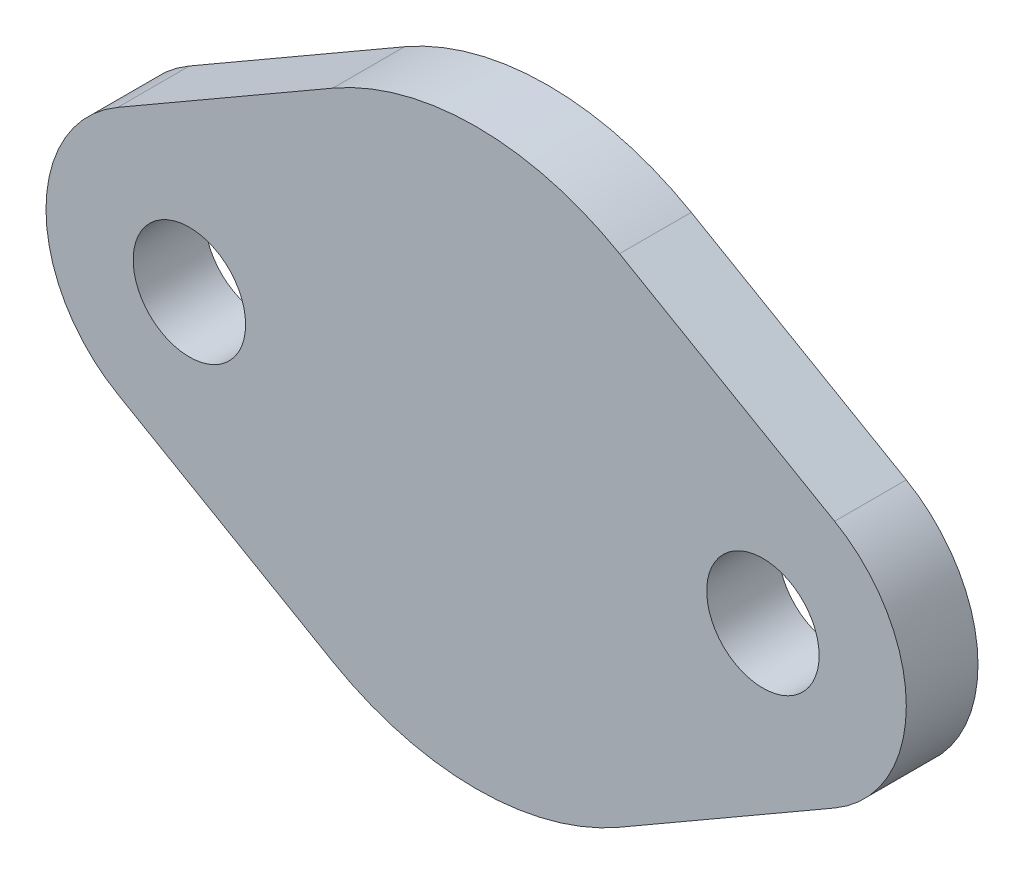
ISO-10303-21;
HEADER;
FILE_DESCRIPTION(('STEP AP214'),'2;1');
FILE_NAME('part.step','',(''),(''),'','','');
FILE_SCHEMA(('AUTOMOTIVE_DESIGN { 1 0 10303 214 1 1 1 1 }'));
ENDSEC;
DATA;
#1=APPLICATION_CONTEXT('core data for automotive mechanical design processes');
#2=APPLICATION_PROTOCOL_DEFINITION('international standard','automotive_design',2000,#1);
#3=PRODUCT_CONTEXT('',#1,'mechanical');
#4=PRODUCT('Part','Part','',(#3));
#5=PRODUCT_RELATED_PRODUCT_CATEGORY('part','',(#4));
#6=PRODUCT_DEFINITION_FORMATION('','',#4);
#7=PRODUCT_DEFINITION_CONTEXT('part definition',#1,'design');
#8=PRODUCT_DEFINITION('design','',#6,#7);
#9=PRODUCT_DEFINITION_SHAPE('','',#8);
#10=(LENGTH_UNIT() NAMED_UNIT(*) SI_UNIT(.MILLI.,.METRE.));
#11=(NAMED_UNIT(*) PLANE_ANGLE_UNIT() SI_UNIT($,.RADIAN.));
#12=(NAMED_UNIT(*) SI_UNIT($,.STERADIAN.) SOLID_ANGLE_UNIT());
#13=UNCERTAINTY_MEASURE_WITH_UNIT(LENGTH_MEASURE(1.E-05),#10,'distance_accuracy_value','');
#14=(GEOMETRIC_REPRESENTATION_CONTEXT(3) GLOBAL_UNCERTAINTY_ASSIGNED_CONTEXT((#13)) GLOBAL_UNIT_ASSIGNED_CONTEXT((#10,
#11,#12)) REPRESENTATION_CONTEXT('',''));
#15=CARTESIAN_POINT('',(0.,0.,0.));
#16=DIRECTION('',(0.,0.,1.));
#17=DIRECTION('',(1.,0.,0.));
#18=AXIS2_PLACEMENT_3D('',#15,#16,#17);
#19=CARTESIAN_POINT('',(-12.7,0.,1.5875));
#20=DIRECTION('',(0.,0.,1.));
#21=DIRECTION('',(1.,0.,0.));
#22=AXIS2_PLACEMENT_3D('',#19,#20,#21);
#23=PLANE('',#22);
#24=CARTESIAN_POINT('',(-12.7,0.,1.5875));
#25=DIRECTION('',(0.,0.,1.));
#26=DIRECTION('',(1.,0.,0.));
#27=AXIS2_PLACEMENT_3D('',#24,#25,#26);
#28=CIRCLE('',#27,2.4892);
#29=CARTESIAN_POINT('',(-10.2108,0.,1.5875));
#30=VERTEX_POINT('',#29);
#31=EDGE_CURVE('E152',#30,#30,#28,.T.);
#32=ORIENTED_EDGE('',*,*,#31,.F.);
#33=EDGE_LOOP('',(#32));
#34=FACE_BOUND('',#33,.T.);
#35=CARTESIAN_POINT('',(-12.7,0.,1.5875));
#36=DIRECTION('',(0.,0.,1.));
#37=DIRECTION('',(1.,0.,0.));
#38=AXIS2_PLACEMENT_3D('',#35,#36,#37);
#39=CIRCLE('',#38,6.35);
#40=CARTESIAN_POINT('',(-15.875,5.49926131403118,1.5875));
#41=VERTEX_POINT('',#40);
#42=CARTESIAN_POINT('',(-15.875,-5.49926131403118,1.5875));
#43=VERTEX_POINT('',#42);
#44=EDGE_CURVE('E170',#41,#43,#39,.T.);
#45=ORIENTED_EDGE('',*,*,#44,.T.);
#46=DIRECTION('',(0.866025403784439,-0.5,0.));
#47=VECTOR('',#46,1.);
#48=CARTESIAN_POINT('',(-15.875,-5.49926131403118,1.5875));
#49=LINE('',#48,#47);
#50=CARTESIAN_POINT('',(-6.34999999999999,-10.9985226280624,1.5875));
#51=VERTEX_POINT('',#50);
#52=EDGE_CURVE('E106',#43,#51,#49,.T.);
#53=ORIENTED_EDGE('',*,*,#52,.T.);
#54=CARTESIAN_POINT('',(0.,0.,1.5875));
#55=DIRECTION('',(0.,0.,1.));
#56=DIRECTION('',(1.,0.,0.));
#57=AXIS2_PLACEMENT_3D('',#54,#55,#56);
#58=CIRCLE('',#57,12.7);
#59=CARTESIAN_POINT('',(6.35,-10.9985226280624,1.5875));
#60=VERTEX_POINT('',#59);
#61=EDGE_CURVE('E191',#51,#60,#58,.T.);
#62=ORIENTED_EDGE('',*,*,#61,.T.);
#63=DIRECTION('',(0.866025403784438,0.5,0.));
#64=VECTOR('',#63,1.);
#65=CARTESIAN_POINT('',(15.875,-5.49926131403118,1.5875));
#66=LINE('',#65,#64);
#67=CARTESIAN_POINT('',(15.875,-5.49926131403118,1.5875));
#68=VERTEX_POINT('',#67);
#69=EDGE_CURVE('E205',#60,#68,#66,.T.);
#70=ORIENTED_EDGE('',*,*,#69,.T.);
#71=CARTESIAN_POINT('',(12.7,0.,1.5875));
#72=DIRECTION('',(0.,0.,1.));
#73=DIRECTION('',(1.,0.,0.));
#74=AXIS2_PLACEMENT_3D('',#71,#72,#73);
#75=CIRCLE('',#74,6.35);
#76=CARTESIAN_POINT('',(15.875,5.49926131403119,1.5875));
#77=VERTEX_POINT('',#76);
#78=EDGE_CURVE('E125',#68,#77,#75,.T.);
#79=ORIENTED_EDGE('',*,*,#78,.T.);
#80=DIRECTION('',(-0.866025403784439,0.5,0.));
#81=VECTOR('',#80,1.);
#82=CARTESIAN_POINT('',(6.34999999999999,10.9985226280624,1.5875));
#83=LINE('',#82,#81);
#84=CARTESIAN_POINT('',(6.34999999999999,10.9985226280624,1.5875));
#85=VERTEX_POINT('',#84);
#86=EDGE_CURVE('E119',#77,#85,#83,.T.);
#87=ORIENTED_EDGE('',*,*,#86,.T.);
#88=CARTESIAN_POINT('',(0.,0.,1.5875));
#89=DIRECTION('',(0.,0.,1.));
#90=DIRECTION('',(1.,0.,0.));
#91=AXIS2_PLACEMENT_3D('',#88,#89,#90);
#92=CIRCLE('',#91,12.7);
#93=CARTESIAN_POINT('',(-6.35,10.9985226280624,1.5875));
#94=VERTEX_POINT('',#93);
#95=EDGE_CURVE('E123',#85,#94,#92,.T.);
#96=ORIENTED_EDGE('',*,*,#95,.T.);
#97=DIRECTION('',(-0.866025403784439,-0.5,0.));
#98=VECTOR('',#97,1.);
#99=CARTESIAN_POINT('',(-15.875,5.49926131403118,1.5875));
#100=LINE('',#99,#98);
#101=EDGE_CURVE('E63',#94,#41,#100,.T.);
#102=ORIENTED_EDGE('',*,*,#101,.T.);
#103=EDGE_LOOP('',(#45,#53,#62,#70,#79,#87,#96,#102));
#104=FACE_BOUND('',#103,.T.);
#105=CARTESIAN_POINT('',(12.7,0.,1.5875));
#106=DIRECTION('',(0.,0.,1.));
#107=DIRECTION('',(1.,0.,0.));
#108=AXIS2_PLACEMENT_3D('',#105,#106,#107);
#109=CIRCLE('',#108,2.4892);
#110=CARTESIAN_POINT('',(15.1892,0.,1.5875));
#111=VERTEX_POINT('',#110);
#112=EDGE_CURVE('E219',#111,#111,#109,.T.);
#113=ORIENTED_EDGE('',*,*,#112,.F.);
#114=EDGE_LOOP('',(#113));
#115=FACE_BOUND('',#114,.T.);
#116=ADVANCED_FACE('F45',(#34,#104,#115),#23,.T.);
#117=CARTESIAN_POINT('',(-12.7,0.,-1.5875));
#118=DIRECTION('',(0.,0.,1.));
#119=DIRECTION('',(1.,0.,0.));
#120=AXIS2_PLACEMENT_3D('',#117,#118,#119);
#121=PLANE('',#120);
#122=CARTESIAN_POINT('',(-12.7,0.,-1.5875));
#123=DIRECTION('',(0.,0.,1.));
#124=DIRECTION('',(1.,0.,0.));
#125=AXIS2_PLACEMENT_3D('',#122,#123,#124);
#126=CIRCLE('',#125,6.35);
#127=CARTESIAN_POINT('',(-15.875,5.49926131403118,-1.5875));
#128=VERTEX_POINT('',#127);
#129=CARTESIAN_POINT('',(-15.875,-5.49926131403118,-1.5875));
#130=VERTEX_POINT('',#129);
#131=EDGE_CURVE('E147',#128,#130,#126,.T.);
#132=ORIENTED_EDGE('',*,*,#131,.F.);
#133=DIRECTION('',(-0.866025403784439,-0.5,0.));
#134=VECTOR('',#133,1.);
#135=CARTESIAN_POINT('',(-15.875,5.49926131403118,-1.5875));
#136=LINE('',#135,#134);
#137=CARTESIAN_POINT('',(-6.35,10.9985226280624,-1.5875));
#138=VERTEX_POINT('',#137);
#139=EDGE_CURVE('E98',#138,#128,#136,.T.);
#140=ORIENTED_EDGE('',*,*,#139,.F.);
#141=CARTESIAN_POINT('',(0.,0.,-1.5875));
#142=DIRECTION('',(0.,0.,1.));
#143=DIRECTION('',(1.,0.,0.));
#144=AXIS2_PLACEMENT_3D('',#141,#142,#143);
#145=CIRCLE('',#144,12.7);
#146=CARTESIAN_POINT('',(6.34999999999999,10.9985226280624,-1.5875));
#147=VERTEX_POINT('',#146);
#148=EDGE_CURVE('E92',#147,#138,#145,.T.);
#149=ORIENTED_EDGE('',*,*,#148,.F.);
#150=DIRECTION('',(-0.866025403784439,0.5,0.));
#151=VECTOR('',#150,1.);
#152=CARTESIAN_POINT('',(6.34999999999999,10.9985226280624,-1.5875));
#153=LINE('',#152,#151);
#154=CARTESIAN_POINT('',(15.875,5.49926131403119,-1.5875));
#155=VERTEX_POINT('',#154);
#156=EDGE_CURVE('E134',#155,#147,#153,.T.);
#157=ORIENTED_EDGE('',*,*,#156,.F.);
#158=CARTESIAN_POINT('',(12.7,0.,-1.5875));
#159=DIRECTION('',(0.,0.,1.));
#160=DIRECTION('',(1.,0.,0.));
#161=AXIS2_PLACEMENT_3D('',#158,#159,#160);
#162=CIRCLE('',#161,6.35);
#163=CARTESIAN_POINT('',(15.875,-5.49926131403118,-1.5875));
#164=VERTEX_POINT('',#163);
#165=EDGE_CURVE('E161',#164,#155,#162,.T.);
#166=ORIENTED_EDGE('',*,*,#165,.F.);
#167=DIRECTION('',(0.866025403784438,0.5,0.));
#168=VECTOR('',#167,1.);
#169=CARTESIAN_POINT('',(15.875,-5.49926131403118,-1.5875));
#170=LINE('',#169,#168);
#171=CARTESIAN_POINT('',(6.35,-10.9985226280624,-1.5875));
#172=VERTEX_POINT('',#171);
#173=EDGE_CURVE('E158',#172,#164,#170,.T.);
#174=ORIENTED_EDGE('',*,*,#173,.F.);
#175=CARTESIAN_POINT('',(0.,0.,-1.5875));
#176=DIRECTION('',(0.,0.,1.));
#177=DIRECTION('',(1.,0.,0.));
#178=AXIS2_PLACEMENT_3D('',#175,#176,#177);
#179=CIRCLE('',#178,12.7);
#180=CARTESIAN_POINT('',(-6.34999999999999,-10.9985226280624,-1.5875));
#181=VERTEX_POINT('',#180);
#182=EDGE_CURVE('E155',#181,#172,#179,.T.);
#183=ORIENTED_EDGE('',*,*,#182,.F.);
#184=DIRECTION('',(0.866025403784439,-0.5,0.));
#185=VECTOR('',#184,1.);
#186=CARTESIAN_POINT('',(-15.875,-5.49926131403118,-1.5875));
#187=LINE('',#186,#185);
#188=EDGE_CURVE('E151',#130,#181,#187,.T.);
#189=ORIENTED_EDGE('',*,*,#188,.F.);
#190=EDGE_LOOP('',(#132,#140,#149,#157,#166,#174,#183,#189));
#191=FACE_BOUND('',#190,.T.);
#192=CARTESIAN_POINT('',(-12.7,0.,-1.5875));
#193=DIRECTION('',(0.,0.,1.));
#194=DIRECTION('',(1.,0.,0.));
#195=AXIS2_PLACEMENT_3D('',#192,#193,#194);
#196=CIRCLE('',#195,2.4892);
#197=CARTESIAN_POINT('',(-10.2108,0.,-1.5875));
#198=VERTEX_POINT('',#197);
#199=EDGE_CURVE('E215',#198,#198,#196,.T.);
#200=ORIENTED_EDGE('',*,*,#199,.T.);
#201=EDGE_LOOP('',(#200));
#202=FACE_BOUND('',#201,.T.);
#203=CARTESIAN_POINT('',(12.7,0.,-1.5875));
#204=DIRECTION('',(0.,0.,1.));
#205=DIRECTION('',(1.,0.,0.));
#206=AXIS2_PLACEMENT_3D('',#203,#204,#205);
#207=CIRCLE('',#206,2.4892);
#208=CARTESIAN_POINT('',(15.1892,0.,-1.5875));
#209=VERTEX_POINT('',#208);
#210=EDGE_CURVE('E223',#209,#209,#207,.T.);
#211=ORIENTED_EDGE('',*,*,#210,.T.);
#212=EDGE_LOOP('',(#211));
#213=FACE_BOUND('',#212,.T.);
#214=ADVANCED_FACE('F195',(#191,#202,#213),#121,.F.);
#215=CARTESIAN_POINT('',(-12.7,0.,1.5875));
#216=DIRECTION('',(0.,0.,-1.));
#217=DIRECTION('',(-1.,0.,0.));
#218=AXIS2_PLACEMENT_3D('',#215,#216,#217);
#219=CYLINDRICAL_SURFACE('',#218,6.35);
#220=ORIENTED_EDGE('',*,*,#131,.T.);
#221=DIRECTION('',(0.,0.,-1.));
#222=VECTOR('',#221,1.);
#223=CARTESIAN_POINT('',(-15.875,-5.49926131403118,1.5875));
#224=LINE('',#223,#222);
#225=EDGE_CURVE('E11',#43,#130,#224,.T.);
#226=ORIENTED_EDGE('',*,*,#225,.F.);
#227=ORIENTED_EDGE('',*,*,#44,.F.);
#228=DIRECTION('',(0.,0.,-1.));
#229=VECTOR('',#228,1.);
#230=CARTESIAN_POINT('',(-15.875,5.49926131403118,1.5875));
#231=LINE('',#230,#229);
#232=EDGE_CURVE('E143',#41,#128,#231,.T.);
#233=ORIENTED_EDGE('',*,*,#232,.T.);
#234=EDGE_LOOP('',(#220,#226,#227,#233));
#235=FACE_BOUND('',#234,.T.);
#236=ADVANCED_FACE('F47',(#235),#219,.T.);
#237=CARTESIAN_POINT('',(-15.875,-5.49926131403118,1.5875));
#238=DIRECTION('',(0.5,0.866025403784439,0.));
#239=DIRECTION('',(-0.866025403784439,0.5,0.));
#240=AXIS2_PLACEMENT_3D('',#237,#238,#239);
#241=PLANE('',#240);
#242=ORIENTED_EDGE('',*,*,#188,.T.);
#243=DIRECTION('',(0.,0.,-1.));
#244=VECTOR('',#243,1.);
#245=CARTESIAN_POINT('',(-6.34999999999999,-10.9985226280624,1.5875));
#246=LINE('',#245,#244);
#247=EDGE_CURVE('E55',#51,#181,#246,.T.);
#248=ORIENTED_EDGE('',*,*,#247,.F.);
#249=ORIENTED_EDGE('',*,*,#52,.F.);
#250=ORIENTED_EDGE('',*,*,#225,.T.);
#251=EDGE_LOOP('',(#242,#248,#249,#250));
#252=FACE_BOUND('',#251,.T.);
#253=ADVANCED_FACE('F257',(#252),#241,.F.);
#254=CARTESIAN_POINT('',(0.,0.,1.5875));
#255=DIRECTION('',(0.,0.,-1.));
#256=DIRECTION('',(-1.,0.,0.));
#257=AXIS2_PLACEMENT_3D('',#254,#255,#256);
#258=CYLINDRICAL_SURFACE('',#257,12.7);
#259=ORIENTED_EDGE('',*,*,#182,.T.);
#260=DIRECTION('',(0.,0.,-1.));
#261=VECTOR('',#260,1.);
#262=CARTESIAN_POINT('',(6.35,-10.9985226280624,1.5875));
#263=LINE('',#262,#261);
#264=EDGE_CURVE('E181',#60,#172,#263,.T.);
#265=ORIENTED_EDGE('',*,*,#264,.F.);
#266=ORIENTED_EDGE('',*,*,#61,.F.);
#267=ORIENTED_EDGE('',*,*,#247,.T.);
#268=EDGE_LOOP('',(#259,#265,#266,#267));
#269=FACE_BOUND('',#268,.T.);
#270=ADVANCED_FACE('F189',(#269),#258,.T.);
#271=CARTESIAN_POINT('',(15.875,-5.49926131403118,1.5875));
#272=DIRECTION('',(-0.5,0.866025403784438,0.));
#273=DIRECTION('',(-0.866025403784438,-0.5,0.));
#274=AXIS2_PLACEMENT_3D('',#271,#272,#273);
#275=PLANE('',#274);
#276=ORIENTED_EDGE('',*,*,#173,.T.);
#277=DIRECTION('',(0.,0.,-1.));
#278=VECTOR('',#277,1.);
#279=CARTESIAN_POINT('',(15.875,-5.49926131403118,1.5875));
#280=LINE('',#279,#278);
#281=EDGE_CURVE('E177',#68,#164,#280,.T.);
#282=ORIENTED_EDGE('',*,*,#281,.F.);
#283=ORIENTED_EDGE('',*,*,#69,.F.);
#284=ORIENTED_EDGE('',*,*,#264,.T.);
#285=EDGE_LOOP('',(#276,#282,#283,#284));
#286=FACE_BOUND('',#285,.T.);
#287=ADVANCED_FACE('F200',(#286),#275,.F.);
#288=CARTESIAN_POINT('',(12.7,0.,1.5875));
#289=DIRECTION('',(0.,0.,-1.));
#290=DIRECTION('',(-1.,0.,0.));
#291=AXIS2_PLACEMENT_3D('',#288,#289,#290);
#292=CYLINDRICAL_SURFACE('',#291,6.35);
#293=ORIENTED_EDGE('',*,*,#165,.T.);
#294=DIRECTION('',(0.,0.,-1.));
#295=VECTOR('',#294,1.);
#296=CARTESIAN_POINT('',(15.875,5.49926131403119,1.5875));
#297=LINE('',#296,#295);
#298=EDGE_CURVE('E136',#77,#155,#297,.T.);
#299=ORIENTED_EDGE('',*,*,#298,.F.);
#300=ORIENTED_EDGE('',*,*,#78,.F.);
#301=ORIENTED_EDGE('',*,*,#281,.T.);
#302=EDGE_LOOP('',(#293,#299,#300,#301));
#303=FACE_BOUND('',#302,.T.);
#304=ADVANCED_FACE('F203',(#303),#292,.T.);
#305=CARTESIAN_POINT('',(6.34999999999999,10.9985226280624,1.5875));
#306=DIRECTION('',(-0.5,-0.866025403784439,0.));
#307=DIRECTION('',(0.866025403784439,-0.5,0.));
#308=AXIS2_PLACEMENT_3D('',#305,#306,#307);
#309=PLANE('',#308);
#310=ORIENTED_EDGE('',*,*,#156,.T.);
#311=DIRECTION('',(0.,0.,-1.));
#312=VECTOR('',#311,1.);
#313=CARTESIAN_POINT('',(6.34999999999999,10.9985226280624,1.5875));
#314=LINE('',#313,#312);
#315=EDGE_CURVE('E131',#85,#147,#314,.T.);
#316=ORIENTED_EDGE('',*,*,#315,.F.);
#317=ORIENTED_EDGE('',*,*,#86,.F.);
#318=ORIENTED_EDGE('',*,*,#298,.T.);
#319=EDGE_LOOP('',(#310,#316,#317,#318));
#320=FACE_BOUND('',#319,.T.);
#321=ADVANCED_FACE('F132',(#320),#309,.F.);
#322=CARTESIAN_POINT('',(0.,0.,1.5875));
#323=DIRECTION('',(0.,0.,-1.));
#324=DIRECTION('',(-1.,0.,0.));
#325=AXIS2_PLACEMENT_3D('',#322,#323,#324);
#326=CYLINDRICAL_SURFACE('',#325,12.7);
#327=ORIENTED_EDGE('',*,*,#148,.T.);
#328=DIRECTION('',(0.,0.,-1.));
#329=VECTOR('',#328,1.);
#330=CARTESIAN_POINT('',(-6.35,10.9985226280624,1.5875));
#331=LINE('',#330,#329);
#332=EDGE_CURVE('E137',#94,#138,#331,.T.);
#333=ORIENTED_EDGE('',*,*,#332,.F.);
#334=ORIENTED_EDGE('',*,*,#95,.F.);
#335=ORIENTED_EDGE('',*,*,#315,.T.);
#336=EDGE_LOOP('',(#327,#333,#334,#335));
#337=FACE_BOUND('',#336,.T.);
#338=ADVANCED_FACE('F139',(#337),#326,.T.);
#339=CARTESIAN_POINT('',(-15.875,5.49926131403118,1.5875));
#340=DIRECTION('',(0.5,-0.866025403784439,0.));
#341=DIRECTION('',(0.866025403784439,0.5,0.));
#342=AXIS2_PLACEMENT_3D('',#339,#340,#341);
#343=PLANE('',#342);
#344=ORIENTED_EDGE('',*,*,#139,.T.);
#345=ORIENTED_EDGE('',*,*,#232,.F.);
#346=ORIENTED_EDGE('',*,*,#101,.F.);
#347=ORIENTED_EDGE('',*,*,#332,.T.);
#348=EDGE_LOOP('',(#344,#345,#346,#347));
#349=FACE_BOUND('',#348,.T.);
#350=ADVANCED_FACE('F245',(#349),#343,.F.);
#351=CARTESIAN_POINT('',(-12.7,0.,1.5875));
#352=DIRECTION('',(0.,0.,-1.));
#353=DIRECTION('',(-1.,0.,0.));
#354=AXIS2_PLACEMENT_3D('',#351,#352,#353);
#355=CYLINDRICAL_SURFACE('',#354,2.4892);
#356=ORIENTED_EDGE('',*,*,#31,.T.);
#357=EDGE_LOOP('',(#356));
#358=FACE_BOUND('',#357,.T.);
#359=ORIENTED_EDGE('',*,*,#199,.F.);
#360=EDGE_LOOP('',(#359));
#361=FACE_BOUND('',#360,.T.);
#362=ADVANCED_FACE('F242',(#358,#361),#355,.F.);
#363=CARTESIAN_POINT('',(12.7,0.,1.5875));
#364=DIRECTION('',(0.,0.,-1.));
#365=DIRECTION('',(-1.,0.,0.));
#366=AXIS2_PLACEMENT_3D('',#363,#364,#365);
#367=CYLINDRICAL_SURFACE('',#366,2.4892);
#368=ORIENTED_EDGE('',*,*,#112,.T.);
#369=EDGE_LOOP('',(#368));
#370=FACE_BOUND('',#369,.T.);
#371=ORIENTED_EDGE('',*,*,#210,.F.);
#372=EDGE_LOOP('',(#371));
#373=FACE_BOUND('',#372,.T.);
#374=ADVANCED_FACE('F231',(#370,#373),#367,.F.);
#375=CLOSED_SHELL('',(#116,#214,#236,#253,#270,#287,#304,#321,#338,#350,#362,#374));
#376=MANIFOLD_SOLID_BREP('B2',#375);
#377=ADVANCED_BREP_SHAPE_REPRESENTATION('',(#18,#376),#14);
#378=SHAPE_DEFINITION_REPRESENTATION(#9,#377);
ENDSEC;
END-ISO-10303-21;
